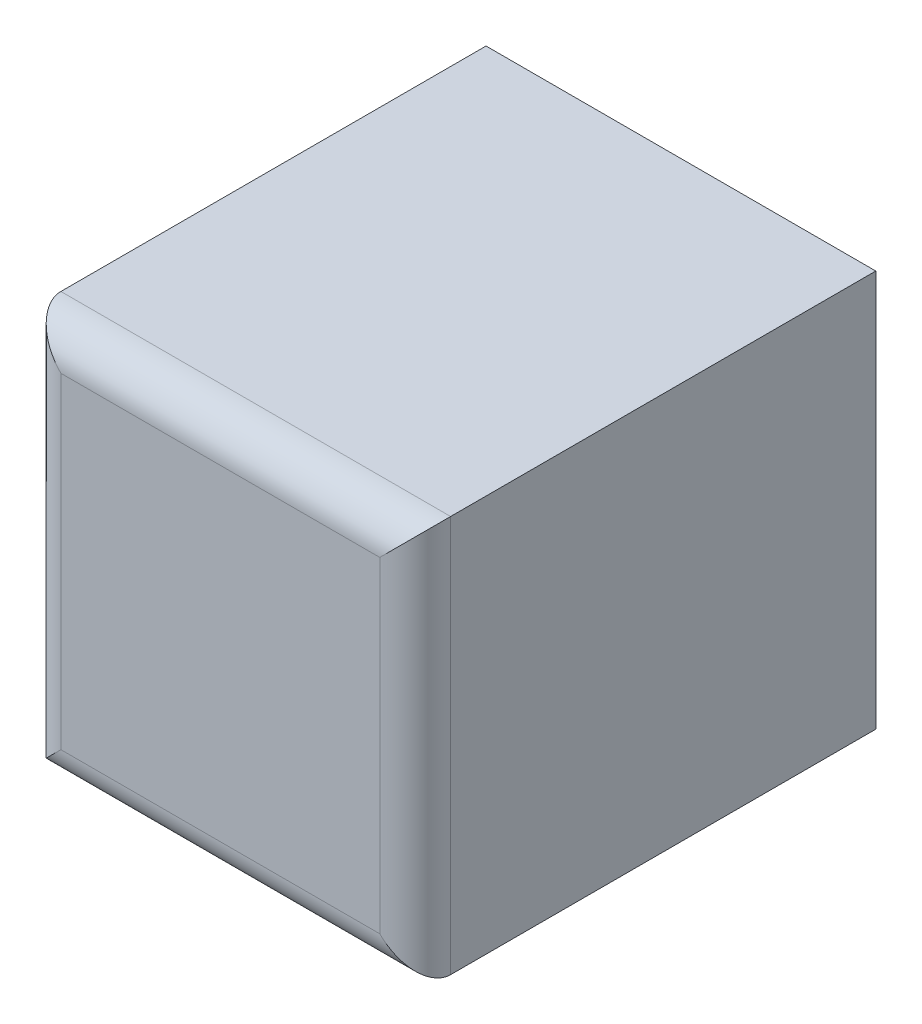
ISO-10303-21;
HEADER;
FILE_DESCRIPTION(('STEP AP214'),'2;1');
FILE_NAME('part.step','',(''),(''),'','','');
FILE_SCHEMA(('AUTOMOTIVE_DESIGN { 1 0 10303 214 1 1 1 1 }'));
ENDSEC;
DATA;
#1=APPLICATION_CONTEXT('core data for automotive mechanical design processes');
#2=APPLICATION_PROTOCOL_DEFINITION('international standard','automotive_design',2000,#1);
#3=PRODUCT_CONTEXT('',#1,'mechanical');
#4=PRODUCT('Part','Part','',(#3));
#5=PRODUCT_RELATED_PRODUCT_CATEGORY('part','',(#4));
#6=PRODUCT_DEFINITION_FORMATION('','',#4);
#7=PRODUCT_DEFINITION_CONTEXT('part definition',#1,'design');
#8=PRODUCT_DEFINITION('design','',#6,#7);
#9=PRODUCT_DEFINITION_SHAPE('','',#8);
#10=(LENGTH_UNIT() NAMED_UNIT(*) SI_UNIT(.MILLI.,.METRE.));
#11=(NAMED_UNIT(*) PLANE_ANGLE_UNIT() SI_UNIT($,.RADIAN.));
#12=(NAMED_UNIT(*) SI_UNIT($,.STERADIAN.) SOLID_ANGLE_UNIT());
#13=UNCERTAINTY_MEASURE_WITH_UNIT(LENGTH_MEASURE(1.E-05),#10,'distance_accuracy_value','');
#14=(GEOMETRIC_REPRESENTATION_CONTEXT(3) GLOBAL_UNCERTAINTY_ASSIGNED_CONTEXT((#13)) GLOBAL_UNIT_ASSIGNED_CONTEXT((#10,
#11,#12)) REPRESENTATION_CONTEXT('',''));
#15=CARTESIAN_POINT('',(0.,0.,0.));
#16=DIRECTION('',(0.,0.,1.));
#17=DIRECTION('',(1.,0.,0.));
#18=AXIS2_PLACEMENT_3D('',#15,#16,#17);
#19=CARTESIAN_POINT('',(0.,0.,65.));
#20=DIRECTION('',(1.,0.,0.));
#21=DIRECTION('',(0.,1.,0.));
#22=AXIS2_PLACEMENT_3D('',#19,#20,#21);
#23=PLANE('',#22);
#24=DIRECTION('',(0.,0.,-1.));
#25=VECTOR('',#24,1.);
#26=CARTESIAN_POINT('',(0.,-56.,65.));
#27=LINE('',#26,#25);
#28=CARTESIAN_POINT('',(0.,-56.,60.));
#29=VERTEX_POINT('',#28);
#30=CARTESIAN_POINT('',(0.,-56.,0.));
#31=VERTEX_POINT('',#30);
#32=EDGE_CURVE('E94',#29,#31,#27,.T.);
#33=ORIENTED_EDGE('',*,*,#32,.F.);
#34=DIRECTION('',(0.,-1.,0.));
#35=VECTOR('',#34,1.);
#36=CARTESIAN_POINT('',(0.,0.,60.));
#37=LINE('',#36,#35);
#38=CARTESIAN_POINT('',(0.,0.,60.));
#39=VERTEX_POINT('',#38);
#40=EDGE_CURVE('E49',#29,#39,#37,.F.);
#41=ORIENTED_EDGE('',*,*,#40,.T.);
#42=DIRECTION('',(0.,0.,-1.));
#43=VECTOR('',#42,1.);
#44=CARTESIAN_POINT('',(0.,0.,65.));
#45=LINE('',#44,#43);
#46=CARTESIAN_POINT('',(0.,0.,0.));
#47=VERTEX_POINT('',#46);
#48=EDGE_CURVE('E111',#39,#47,#45,.T.);
#49=ORIENTED_EDGE('',*,*,#48,.T.);
#50=DIRECTION('',(0.,-1.,0.));
#51=VECTOR('',#50,1.);
#52=CARTESIAN_POINT('',(0.,0.,0.));
#53=LINE('',#52,#51);
#54=EDGE_CURVE('E109',#47,#31,#53,.T.);
#55=ORIENTED_EDGE('',*,*,#54,.T.);
#56=EDGE_LOOP('',(#33,#41,#49,#55));
#57=FACE_BOUND('',#56,.T.);
#58=ADVANCED_FACE('F41',(#57),#23,.F.);
#59=CARTESIAN_POINT('',(0.,-56.,65.));
#60=DIRECTION('',(0.,1.,0.));
#61=DIRECTION('',(0.,0.,1.));
#62=AXIS2_PLACEMENT_3D('',#59,#60,#61);
#63=PLANE('',#62);
#64=DIRECTION('',(0.,0.,-1.));
#65=VECTOR('',#64,1.);
#66=CARTESIAN_POINT('',(55.,-56.,65.));
#67=LINE('',#66,#65);
#68=CARTESIAN_POINT('',(55.,-56.,60.));
#69=VERTEX_POINT('',#68);
#70=CARTESIAN_POINT('',(55.,-56.,0.));
#71=VERTEX_POINT('',#70);
#72=EDGE_CURVE('E102',#69,#71,#67,.T.);
#73=ORIENTED_EDGE('',*,*,#72,.F.);
#74=DIRECTION('',(1.,0.,0.));
#75=VECTOR('',#74,1.);
#76=CARTESIAN_POINT('',(0.,-56.,60.));
#77=LINE('',#76,#75);
#78=EDGE_CURVE('E101',#69,#29,#77,.F.);
#79=ORIENTED_EDGE('',*,*,#78,.T.);
#80=ORIENTED_EDGE('',*,*,#32,.T.);
#81=DIRECTION('',(1.,0.,0.));
#82=VECTOR('',#81,1.);
#83=CARTESIAN_POINT('',(0.,-56.,0.));
#84=LINE('',#83,#82);
#85=EDGE_CURVE('E98',#31,#71,#84,.T.);
#86=ORIENTED_EDGE('',*,*,#85,.T.);
#87=EDGE_LOOP('',(#73,#79,#80,#86));
#88=FACE_BOUND('',#87,.T.);
#89=ADVANCED_FACE('F100',(#88),#63,.F.);
#90=CARTESIAN_POINT('',(55.,0.,65.));
#91=DIRECTION('',(-1.,0.,0.));
#92=DIRECTION('',(0.,-1.,0.));
#93=AXIS2_PLACEMENT_3D('',#90,#91,#92);
#94=PLANE('',#93);
#95=DIRECTION('',(0.,0.,-1.));
#96=VECTOR('',#95,1.);
#97=CARTESIAN_POINT('',(55.,0.,65.));
#98=LINE('',#97,#96);
#99=CARTESIAN_POINT('',(55.,0.,60.));
#100=VERTEX_POINT('',#99);
#101=CARTESIAN_POINT('',(55.,0.,0.));
#102=VERTEX_POINT('',#101);
#103=EDGE_CURVE('E122',#100,#102,#98,.T.);
#104=ORIENTED_EDGE('',*,*,#103,.F.);
#105=DIRECTION('',(0.,1.,0.));
#106=VECTOR('',#105,1.);
#107=CARTESIAN_POINT('',(55.,-56.,60.));
#108=LINE('',#107,#106);
#109=EDGE_CURVE('E136',#100,#69,#108,.F.);
#110=ORIENTED_EDGE('',*,*,#109,.T.);
#111=ORIENTED_EDGE('',*,*,#72,.T.);
#112=DIRECTION('',(0.,1.,0.));
#113=VECTOR('',#112,1.);
#114=CARTESIAN_POINT('',(55.,0.,0.));
#115=LINE('',#114,#113);
#116=EDGE_CURVE('E115',#71,#102,#115,.T.);
#117=ORIENTED_EDGE('',*,*,#116,.T.);
#118=EDGE_LOOP('',(#104,#110,#111,#117));
#119=FACE_BOUND('',#118,.T.);
#120=ADVANCED_FACE('F172',(#119),#94,.F.);
#121=CARTESIAN_POINT('',(0.,0.,65.));
#122=DIRECTION('',(0.,-1.,0.));
#123=DIRECTION('',(0.,0.,-1.));
#124=AXIS2_PLACEMENT_3D('',#121,#122,#123);
#125=PLANE('',#124);
#126=ORIENTED_EDGE('',*,*,#48,.F.);
#127=DIRECTION('',(-1.,0.,0.));
#128=VECTOR('',#127,1.);
#129=CARTESIAN_POINT('',(55.,0.,60.));
#130=LINE('',#129,#128);
#131=EDGE_CURVE('E11',#39,#100,#130,.F.);
#132=ORIENTED_EDGE('',*,*,#131,.T.);
#133=ORIENTED_EDGE('',*,*,#103,.T.);
#134=DIRECTION('',(-1.,0.,0.));
#135=VECTOR('',#134,1.);
#136=CARTESIAN_POINT('',(0.,0.,0.));
#137=LINE('',#136,#135);
#138=EDGE_CURVE('E121',#102,#47,#137,.T.);
#139=ORIENTED_EDGE('',*,*,#138,.T.);
#140=EDGE_LOOP('',(#126,#132,#133,#139));
#141=FACE_BOUND('',#140,.T.);
#142=ADVANCED_FACE('F215',(#141),#125,.F.);
#143=CARTESIAN_POINT('',(0.,0.,65.));
#144=DIRECTION('',(0.,0.,1.));
#145=DIRECTION('',(1.,0.,0.));
#146=AXIS2_PLACEMENT_3D('',#143,#144,#145);
#147=PLANE('',#146);
#148=DIRECTION('',(0.,-1.,0.));
#149=VECTOR('',#148,1.);
#150=CARTESIAN_POINT('',(5.00000000000001,-56.,65.));
#151=LINE('',#150,#149);
#152=CARTESIAN_POINT('',(5.,-5.,65.));
#153=VERTEX_POINT('',#152);
#154=CARTESIAN_POINT('',(5.00000000000001,-51.,65.));
#155=VERTEX_POINT('',#154);
#156=EDGE_CURVE('E126',#153,#155,#151,.T.);
#157=ORIENTED_EDGE('',*,*,#156,.T.);
#158=DIRECTION('',(1.,0.,0.));
#159=VECTOR('',#158,1.);
#160=CARTESIAN_POINT('',(55.,-51.,65.));
#161=LINE('',#160,#159);
#162=CARTESIAN_POINT('',(50.,-51.,65.));
#163=VERTEX_POINT('',#162);
#164=EDGE_CURVE('E135',#155,#163,#161,.T.);
#165=ORIENTED_EDGE('',*,*,#164,.T.);
#166=DIRECTION('',(0.,1.,0.));
#167=VECTOR('',#166,1.);
#168=CARTESIAN_POINT('',(50.,0.,65.));
#169=LINE('',#168,#167);
#170=CARTESIAN_POINT('',(50.,-5.,65.));
#171=VERTEX_POINT('',#170);
#172=EDGE_CURVE('E128',#163,#171,#169,.T.);
#173=ORIENTED_EDGE('',*,*,#172,.T.);
#174=DIRECTION('',(-1.,0.,0.));
#175=VECTOR('',#174,1.);
#176=CARTESIAN_POINT('',(0.,-5.,65.));
#177=LINE('',#176,#175);
#178=EDGE_CURVE('E103',#171,#153,#177,.T.);
#179=ORIENTED_EDGE('',*,*,#178,.T.);
#180=EDGE_LOOP('',(#157,#165,#173,#179));
#181=FACE_BOUND('',#180,.T.);
#182=ADVANCED_FACE('F152',(#181),#147,.T.);
#183=CARTESIAN_POINT('',(0.,0.,0.));
#184=DIRECTION('',(0.,0.,1.));
#185=DIRECTION('',(1.,0.,0.));
#186=AXIS2_PLACEMENT_3D('',#183,#184,#185);
#187=PLANE('',#186);
#188=ORIENTED_EDGE('',*,*,#54,.F.);
#189=ORIENTED_EDGE('',*,*,#138,.F.);
#190=ORIENTED_EDGE('',*,*,#116,.F.);
#191=ORIENTED_EDGE('',*,*,#85,.F.);
#192=EDGE_LOOP('',(#188,#189,#190,#191));
#193=FACE_BOUND('',#192,.T.);
#194=ADVANCED_FACE('F107',(#193),#187,.F.);
#195=CARTESIAN_POINT('',(0.,-5.,60.));
#196=DIRECTION('',(1.,0.,0.));
#197=DIRECTION('',(0.,0.,-1.));
#198=AXIS2_PLACEMENT_3D('',#195,#196,#197);
#199=CYLINDRICAL_SURFACE('',#198,5.);
#200=CARTESIAN_POINT('',(50.,-5.,60.));
#201=DIRECTION('',(0.707106781186548,-0.707106781186547,0.));
#202=DIRECTION('',(0.707106781186547,0.707106781186548,0.));
#203=AXIS2_PLACEMENT_3D('',#200,#201,#202);
#204=ELLIPSE('',#203,7.07106781186547,5.);
#205=EDGE_CURVE('E117',#100,#171,#204,.T.);
#206=ORIENTED_EDGE('',*,*,#205,.F.);
#207=ORIENTED_EDGE('',*,*,#131,.F.);
#208=CARTESIAN_POINT('',(5.,-5.,60.));
#209=DIRECTION('',(0.707106781186547,0.707106781186548,0.));
#210=DIRECTION('',(0.707106781186548,-0.707106781186547,0.));
#211=AXIS2_PLACEMENT_3D('',#208,#209,#210);
#212=ELLIPSE('',#211,7.07106781186548,5.);
#213=EDGE_CURVE('E44',#153,#39,#212,.F.);
#214=ORIENTED_EDGE('',*,*,#213,.F.);
#215=ORIENTED_EDGE('',*,*,#178,.F.);
#216=EDGE_LOOP('',(#206,#207,#214,#215));
#217=FACE_BOUND('',#216,.T.);
#218=ADVANCED_FACE('F43',(#217),#199,.T.);
#219=CARTESIAN_POINT('',(5.,0.,60.));
#220=DIRECTION('',(0.,1.,0.));
#221=DIRECTION('',(-1.,0.,0.));
#222=AXIS2_PLACEMENT_3D('',#219,#220,#221);
#223=CYLINDRICAL_SURFACE('',#222,5.);
#224=ORIENTED_EDGE('',*,*,#213,.T.);
#225=ORIENTED_EDGE('',*,*,#40,.F.);
#226=CARTESIAN_POINT('',(5.00000000000001,-51.,60.));
#227=DIRECTION('',(-0.707106781186548,0.707106781186547,0.));
#228=DIRECTION('',(0.707106781186547,0.707106781186548,0.));
#229=AXIS2_PLACEMENT_3D('',#226,#227,#228);
#230=ELLIPSE('',#229,7.07106781186547,5.);
#231=EDGE_CURVE('E143',#155,#29,#230,.F.);
#232=ORIENTED_EDGE('',*,*,#231,.F.);
#233=ORIENTED_EDGE('',*,*,#156,.F.);
#234=EDGE_LOOP('',(#224,#225,#232,#233));
#235=FACE_BOUND('',#234,.T.);
#236=ADVANCED_FACE('F159',(#235),#223,.T.);
#237=CARTESIAN_POINT('',(50.,0.,60.));
#238=DIRECTION('',(0.,-1.,0.));
#239=DIRECTION('',(1.,0.,0.));
#240=AXIS2_PLACEMENT_3D('',#237,#238,#239);
#241=CYLINDRICAL_SURFACE('',#240,5.);
#242=ORIENTED_EDGE('',*,*,#205,.T.);
#243=ORIENTED_EDGE('',*,*,#172,.F.);
#244=CARTESIAN_POINT('',(50.,-51.,60.));
#245=DIRECTION('',(-0.707106781186547,-0.707106781186548,0.));
#246=DIRECTION('',(0.707106781186548,-0.707106781186547,0.));
#247=AXIS2_PLACEMENT_3D('',#244,#245,#246);
#248=ELLIPSE('',#247,7.07106781186548,5.);
#249=EDGE_CURVE('E137',#69,#163,#248,.T.);
#250=ORIENTED_EDGE('',*,*,#249,.F.);
#251=ORIENTED_EDGE('',*,*,#109,.F.);
#252=EDGE_LOOP('',(#242,#243,#250,#251));
#253=FACE_BOUND('',#252,.T.);
#254=ADVANCED_FACE('F150',(#253),#241,.T.);
#255=CARTESIAN_POINT('',(0.,-51.,60.));
#256=DIRECTION('',(-1.,0.,0.));
#257=DIRECTION('',(0.,0.,1.));
#258=AXIS2_PLACEMENT_3D('',#255,#256,#257);
#259=CYLINDRICAL_SURFACE('',#258,5.);
#260=ORIENTED_EDGE('',*,*,#231,.T.);
#261=ORIENTED_EDGE('',*,*,#78,.F.);
#262=ORIENTED_EDGE('',*,*,#249,.T.);
#263=ORIENTED_EDGE('',*,*,#164,.F.);
#264=EDGE_LOOP('',(#260,#261,#262,#263));
#265=FACE_BOUND('',#264,.T.);
#266=ADVANCED_FACE('F158',(#265),#259,.T.);
#267=CLOSED_SHELL('',(#58,#89,#120,#142,#182,#194,#218,#236,#254,#266));
#268=MANIFOLD_SOLID_BREP('B2',#267);
#269=ADVANCED_BREP_SHAPE_REPRESENTATION('',(#18,#268),#14);
#270=SHAPE_DEFINITION_REPRESENTATION(#9,#269);
ENDSEC;
END-ISO-10303-21;
